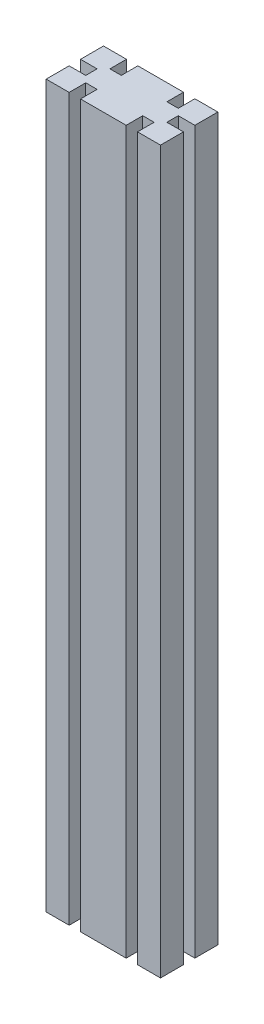
ISO-10303-21;
HEADER;
FILE_DESCRIPTION(('STEP AP214'),'2;1');
FILE_NAME('part.step','',(''),(''),'','','');
FILE_SCHEMA(('AUTOMOTIVE_DESIGN { 1 0 10303 214 1 1 1 1 }'));
ENDSEC;
DATA;
#1=APPLICATION_CONTEXT('core data for automotive mechanical design processes');
#2=APPLICATION_PROTOCOL_DEFINITION('international standard','automotive_design',2000,#1);
#3=PRODUCT_CONTEXT('',#1,'mechanical');
#4=PRODUCT('Part','Part','',(#3));
#5=PRODUCT_RELATED_PRODUCT_CATEGORY('part','',(#4));
#6=PRODUCT_DEFINITION_FORMATION('','',#4);
#7=PRODUCT_DEFINITION_CONTEXT('part definition',#1,'design');
#8=PRODUCT_DEFINITION('design','',#6,#7);
#9=PRODUCT_DEFINITION_SHAPE('','',#8);
#10=(LENGTH_UNIT() NAMED_UNIT(*) SI_UNIT(.MILLI.,.METRE.));
#11=(NAMED_UNIT(*) PLANE_ANGLE_UNIT() SI_UNIT($,.RADIAN.));
#12=(NAMED_UNIT(*) SI_UNIT($,.STERADIAN.) SOLID_ANGLE_UNIT());
#13=UNCERTAINTY_MEASURE_WITH_UNIT(LENGTH_MEASURE(1.E-05),#10,'distance_accuracy_value','');
#14=(GEOMETRIC_REPRESENTATION_CONTEXT(3) GLOBAL_UNCERTAINTY_ASSIGNED_CONTEXT((#13)) GLOBAL_UNIT_ASSIGNED_CONTEXT((#10,
#11,#12)) REPRESENTATION_CONTEXT('',''));
#15=CARTESIAN_POINT('',(0.,0.,0.));
#16=DIRECTION('',(0.,0.,1.));
#17=DIRECTION('',(1.,0.,0.));
#18=AXIS2_PLACEMENT_3D('',#15,#16,#17);
#19=CARTESIAN_POINT('',(28.575,508.,0.));
#20=DIRECTION('',(-1.,0.,0.));
#21=DIRECTION('',(0.,0.,1.));
#22=AXIS2_PLACEMENT_3D('',#19,#20,#21);
#23=PLANE('',#22);
#24=DIRECTION('',(0.,0.,-1.));
#25=VECTOR('',#24,1.);
#26=CARTESIAN_POINT('',(28.575,0.,0.));
#27=LINE('',#26,#25);
#28=CARTESIAN_POINT('',(28.575,0.,4.));
#29=VERTEX_POINT('',#28);
#30=CARTESIAN_POINT('',(28.575,0.,-4.));
#31=VERTEX_POINT('',#30);
#32=EDGE_CURVE('E385',#29,#31,#27,.T.);
#33=ORIENTED_EDGE('',*,*,#32,.T.);
#34=DIRECTION('',(0.,-1.,0.));
#35=VECTOR('',#34,1.);
#36=CARTESIAN_POINT('',(28.575,508.,-4.));
#37=LINE('',#36,#35);
#38=CARTESIAN_POINT('',(28.575,508.,-4.));
#39=VERTEX_POINT('',#38);
#40=EDGE_CURVE('E11',#39,#31,#37,.T.);
#41=ORIENTED_EDGE('',*,*,#40,.F.);
#42=DIRECTION('',(0.,0.,-1.));
#43=VECTOR('',#42,1.);
#44=CARTESIAN_POINT('',(28.575,508.,0.));
#45=LINE('',#44,#43);
#46=CARTESIAN_POINT('',(28.575,508.,4.));
#47=VERTEX_POINT('',#46);
#48=EDGE_CURVE('E282',#47,#39,#45,.T.);
#49=ORIENTED_EDGE('',*,*,#48,.F.);
#50=DIRECTION('',(0.,-1.,0.));
#51=VECTOR('',#50,1.);
#52=CARTESIAN_POINT('',(28.575,508.,4.));
#53=LINE('',#52,#51);
#54=EDGE_CURVE('E64',#47,#29,#53,.T.);
#55=ORIENTED_EDGE('',*,*,#54,.T.);
#56=EDGE_LOOP('',(#33,#41,#49,#55));
#57=FACE_BOUND('',#56,.T.);
#58=ADVANCED_FACE('F47',(#57),#23,.F.);
#59=CARTESIAN_POINT('',(0.,508.,-4.));
#60=DIRECTION('',(0.,0.,-1.));
#61=DIRECTION('',(-1.,0.,0.));
#62=AXIS2_PLACEMENT_3D('',#59,#60,#61);
#63=PLANE('',#62);
#64=DIRECTION('',(1.,0.,0.));
#65=VECTOR('',#64,1.);
#66=CARTESIAN_POINT('',(0.,0.,-4.));
#67=LINE('',#66,#65);
#68=CARTESIAN_POINT('',(40.259,0.,-4.));
#69=VERTEX_POINT('',#68);
#70=EDGE_CURVE('E382',#31,#69,#67,.T.);
#71=ORIENTED_EDGE('',*,*,#70,.T.);
#72=DIRECTION('',(0.,-1.,0.));
#73=VECTOR('',#72,1.);
#74=CARTESIAN_POINT('',(40.259,508.,-4.));
#75=LINE('',#74,#73);
#76=CARTESIAN_POINT('',(40.259,508.,-4.));
#77=VERTEX_POINT('',#76);
#78=EDGE_CURVE('E56',#77,#69,#75,.T.);
#79=ORIENTED_EDGE('',*,*,#78,.F.);
#80=DIRECTION('',(1.,0.,0.));
#81=VECTOR('',#80,1.);
#82=CARTESIAN_POINT('',(0.,508.,-4.));
#83=LINE('',#82,#81);
#84=EDGE_CURVE('E162',#39,#77,#83,.T.);
#85=ORIENTED_EDGE('',*,*,#84,.F.);
#86=ORIENTED_EDGE('',*,*,#40,.T.);
#87=EDGE_LOOP('',(#71,#79,#85,#86));
#88=FACE_BOUND('',#87,.T.);
#89=ADVANCED_FACE('F383',(#88),#63,.F.);
#90=CARTESIAN_POINT('',(40.259,508.,0.));
#91=DIRECTION('',(1.,0.,0.));
#92=DIRECTION('',(0.,0.,-1.));
#93=AXIS2_PLACEMENT_3D('',#90,#91,#92);
#94=PLANE('',#93);
#95=DIRECTION('',(0.,0.,1.));
#96=VECTOR('',#95,1.);
#97=CARTESIAN_POINT('',(40.259,0.,0.));
#98=LINE('',#97,#96);
#99=CARTESIAN_POINT('',(40.259,0.,-20.193));
#100=VERTEX_POINT('',#99);
#101=EDGE_CURVE('E294',#100,#69,#98,.T.);
#102=ORIENTED_EDGE('',*,*,#101,.F.);
#103=DIRECTION('',(0.,-1.,0.));
#104=VECTOR('',#103,1.);
#105=CARTESIAN_POINT('',(40.259,508.,-20.193));
#106=LINE('',#105,#104);
#107=CARTESIAN_POINT('',(40.259,508.,-20.193));
#108=VERTEX_POINT('',#107);
#109=EDGE_CURVE('E374',#108,#100,#106,.T.);
#110=ORIENTED_EDGE('',*,*,#109,.F.);
#111=DIRECTION('',(0.,0.,1.));
#112=VECTOR('',#111,1.);
#113=CARTESIAN_POINT('',(40.259,508.,0.));
#114=LINE('',#113,#112);
#115=EDGE_CURVE('E266',#108,#77,#114,.T.);
#116=ORIENTED_EDGE('',*,*,#115,.T.);
#117=ORIENTED_EDGE('',*,*,#78,.T.);
#118=EDGE_LOOP('',(#102,#110,#116,#117));
#119=FACE_BOUND('',#118,.T.);
#120=ADVANCED_FACE('F379',(#119),#94,.T.);
#121=CARTESIAN_POINT('',(0.,508.,-20.193));
#122=DIRECTION('',(0.,0.,-1.));
#123=DIRECTION('',(-1.,0.,0.));
#124=AXIS2_PLACEMENT_3D('',#121,#122,#123);
#125=PLANE('',#124);
#126=DIRECTION('',(1.,0.,0.));
#127=VECTOR('',#126,1.);
#128=CARTESIAN_POINT('',(0.,0.,-20.193));
#129=LINE('',#128,#127);
#130=CARTESIAN_POINT('',(24.075,0.,-20.193));
#131=VERTEX_POINT('',#130);
#132=EDGE_CURVE('E390',#131,#100,#129,.T.);
#133=ORIENTED_EDGE('',*,*,#132,.F.);
#134=DIRECTION('',(0.,-1.,0.));
#135=VECTOR('',#134,1.);
#136=CARTESIAN_POINT('',(24.075,508.,-20.193));
#137=LINE('',#136,#135);
#138=CARTESIAN_POINT('',(24.075,508.,-20.193));
#139=VERTEX_POINT('',#138);
#140=EDGE_CURVE('E371',#139,#131,#137,.T.);
#141=ORIENTED_EDGE('',*,*,#140,.F.);
#142=DIRECTION('',(1.,0.,0.));
#143=VECTOR('',#142,1.);
#144=CARTESIAN_POINT('',(0.,508.,-20.193));
#145=LINE('',#144,#143);
#146=EDGE_CURVE('E273',#139,#108,#145,.T.);
#147=ORIENTED_EDGE('',*,*,#146,.T.);
#148=ORIENTED_EDGE('',*,*,#109,.T.);
#149=EDGE_LOOP('',(#133,#141,#147,#148));
#150=FACE_BOUND('',#149,.T.);
#151=ADVANCED_FACE('F508',(#150),#125,.T.);
#152=CARTESIAN_POINT('',(24.075,508.,0.));
#153=DIRECTION('',(1.,0.,0.));
#154=DIRECTION('',(0.,0.,-1.));
#155=AXIS2_PLACEMENT_3D('',#152,#153,#154);
#156=PLANE('',#155);
#157=DIRECTION('',(0.,0.,1.));
#158=VECTOR('',#157,1.);
#159=CARTESIAN_POINT('',(24.075,0.,0.));
#160=LINE('',#159,#158);
#161=CARTESIAN_POINT('',(24.075,0.,-8.509));
#162=VERTEX_POINT('',#161);
#163=EDGE_CURVE('E393',#131,#162,#160,.T.);
#164=ORIENTED_EDGE('',*,*,#163,.T.);
#165=DIRECTION('',(0.,-1.,0.));
#166=VECTOR('',#165,1.);
#167=CARTESIAN_POINT('',(24.075,508.,-8.509));
#168=LINE('',#167,#166);
#169=CARTESIAN_POINT('',(24.075,508.,-8.509));
#170=VERTEX_POINT('',#169);
#171=EDGE_CURVE('E368',#170,#162,#168,.T.);
#172=ORIENTED_EDGE('',*,*,#171,.F.);
#173=DIRECTION('',(0.,0.,1.));
#174=VECTOR('',#173,1.);
#175=CARTESIAN_POINT('',(24.075,508.,0.));
#176=LINE('',#175,#174);
#177=EDGE_CURVE('E279',#139,#170,#176,.T.);
#178=ORIENTED_EDGE('',*,*,#177,.F.);
#179=ORIENTED_EDGE('',*,*,#140,.T.);
#180=EDGE_LOOP('',(#164,#172,#178,#179));
#181=FACE_BOUND('',#180,.T.);
#182=ADVANCED_FACE('F510',(#181),#156,.F.);
#183=CARTESIAN_POINT('',(0.,508.,-8.509));
#184=DIRECTION('',(0.,0.,-1.));
#185=DIRECTION('',(-1.,0.,0.));
#186=AXIS2_PLACEMENT_3D('',#183,#184,#185);
#187=PLANE('',#186);
#188=DIRECTION('',(1.,0.,0.));
#189=VECTOR('',#188,1.);
#190=CARTESIAN_POINT('',(0.,0.,-8.509));
#191=LINE('',#190,#189);
#192=CARTESIAN_POINT('',(16.075,0.,-8.509));
#193=VERTEX_POINT('',#192);
#194=EDGE_CURVE('E402',#193,#162,#191,.T.);
#195=ORIENTED_EDGE('',*,*,#194,.F.);
#196=DIRECTION('',(0.,-1.,0.));
#197=VECTOR('',#196,1.);
#198=CARTESIAN_POINT('',(16.075,508.,-8.509));
#199=LINE('',#198,#197);
#200=CARTESIAN_POINT('',(16.075,508.,-8.509));
#201=VERTEX_POINT('',#200);
#202=EDGE_CURVE('E365',#201,#193,#199,.T.);
#203=ORIENTED_EDGE('',*,*,#202,.F.);
#204=DIRECTION('',(1.,0.,0.));
#205=VECTOR('',#204,1.);
#206=CARTESIAN_POINT('',(0.,508.,-8.509));
#207=LINE('',#206,#205);
#208=EDGE_CURVE('E769',#201,#170,#207,.T.);
#209=ORIENTED_EDGE('',*,*,#208,.T.);
#210=ORIENTED_EDGE('',*,*,#171,.T.);
#211=EDGE_LOOP('',(#195,#203,#209,#210));
#212=FACE_BOUND('',#211,.T.);
#213=ADVANCED_FACE('F513',(#212),#187,.T.);
#214=CARTESIAN_POINT('',(16.075,508.,0.));
#215=DIRECTION('',(1.,0.,0.));
#216=DIRECTION('',(0.,0.,-1.));
#217=AXIS2_PLACEMENT_3D('',#214,#215,#216);
#218=PLANE('',#217);
#219=DIRECTION('',(0.,0.,1.));
#220=VECTOR('',#219,1.);
#221=CARTESIAN_POINT('',(16.075,0.,0.));
#222=LINE('',#221,#220);
#223=CARTESIAN_POINT('',(16.075,0.,-20.193));
#224=VERTEX_POINT('',#223);
#225=EDGE_CURVE('E406',#224,#193,#222,.T.);
#226=ORIENTED_EDGE('',*,*,#225,.F.);
#227=DIRECTION('',(0.,-1.,0.));
#228=VECTOR('',#227,1.);
#229=CARTESIAN_POINT('',(16.075,508.,-20.193));
#230=LINE('',#229,#228);
#231=CARTESIAN_POINT('',(16.075,508.,-20.193));
#232=VERTEX_POINT('',#231);
#233=EDGE_CURVE('E362',#232,#224,#230,.T.);
#234=ORIENTED_EDGE('',*,*,#233,.F.);
#235=DIRECTION('',(0.,0.,1.));
#236=VECTOR('',#235,1.);
#237=CARTESIAN_POINT('',(16.075,508.,0.));
#238=LINE('',#237,#236);
#239=EDGE_CURVE('E775',#232,#201,#238,.T.);
#240=ORIENTED_EDGE('',*,*,#239,.T.);
#241=ORIENTED_EDGE('',*,*,#202,.T.);
#242=EDGE_LOOP('',(#226,#234,#240,#241));
#243=FACE_BOUND('',#242,.T.);
#244=ADVANCED_FACE('F517',(#243),#218,.T.);
#245=CARTESIAN_POINT('',(-16.075,0.,-20.193));
#246=VERTEX_POINT('',#245);
#247=EDGE_CURVE('E396',#246,#224,#129,.T.);
#248=ORIENTED_EDGE('',*,*,#247,.F.);
#249=DIRECTION('',(0.,-1.,0.));
#250=VECTOR('',#249,1.);
#251=CARTESIAN_POINT('',(-16.075,508.,-20.193));
#252=LINE('',#251,#250);
#253=CARTESIAN_POINT('',(-16.075,508.,-20.193));
#254=VERTEX_POINT('',#253);
#255=EDGE_CURVE('E359',#254,#246,#252,.T.);
#256=ORIENTED_EDGE('',*,*,#255,.F.);
#257=EDGE_CURVE('E281',#254,#232,#145,.T.);
#258=ORIENTED_EDGE('',*,*,#257,.T.);
#259=ORIENTED_EDGE('',*,*,#233,.T.);
#260=EDGE_LOOP('',(#248,#256,#258,#259));
#261=FACE_BOUND('',#260,.T.);
#262=ADVANCED_FACE('F521',(#261),#125,.T.);
#263=CARTESIAN_POINT('',(-16.075,508.,0.));
#264=DIRECTION('',(1.,0.,0.));
#265=DIRECTION('',(0.,0.,-1.));
#266=AXIS2_PLACEMENT_3D('',#263,#264,#265);
#267=PLANE('',#266);
#268=DIRECTION('',(0.,0.,1.));
#269=VECTOR('',#268,1.);
#270=CARTESIAN_POINT('',(-16.075,0.,0.));
#271=LINE('',#270,#269);
#272=CARTESIAN_POINT('',(-16.075,0.,-8.509));
#273=VERTEX_POINT('',#272);
#274=EDGE_CURVE('E410',#246,#273,#271,.T.);
#275=ORIENTED_EDGE('',*,*,#274,.T.);
#276=DIRECTION('',(0.,-1.,0.));
#277=VECTOR('',#276,1.);
#278=CARTESIAN_POINT('',(-16.075,508.,-8.509));
#279=LINE('',#278,#277);
#280=CARTESIAN_POINT('',(-16.075,508.,-8.509));
#281=VERTEX_POINT('',#280);
#282=EDGE_CURVE('E355',#281,#273,#279,.T.);
#283=ORIENTED_EDGE('',*,*,#282,.F.);
#284=DIRECTION('',(0.,0.,1.));
#285=VECTOR('',#284,1.);
#286=CARTESIAN_POINT('',(-16.075,508.,0.));
#287=LINE('',#286,#285);
#288=EDGE_CURVE('E780',#254,#281,#287,.T.);
#289=ORIENTED_EDGE('',*,*,#288,.F.);
#290=ORIENTED_EDGE('',*,*,#255,.T.);
#291=EDGE_LOOP('',(#275,#283,#289,#290));
#292=FACE_BOUND('',#291,.T.);
#293=ADVANCED_FACE('F523',(#292),#267,.F.);
#294=CARTESIAN_POINT('',(0.,508.,-8.509));
#295=DIRECTION('',(0.,0.,1.));
#296=DIRECTION('',(1.,0.,0.));
#297=AXIS2_PLACEMENT_3D('',#294,#295,#296);
#298=PLANE('',#297);
#299=DIRECTION('',(-1.,0.,0.));
#300=VECTOR('',#299,1.);
#301=CARTESIAN_POINT('',(0.,0.,-8.509));
#302=LINE('',#301,#300);
#303=CARTESIAN_POINT('',(-24.075,0.,-8.509));
#304=VERTEX_POINT('',#303);
#305=EDGE_CURVE('E413',#273,#304,#302,.T.);
#306=ORIENTED_EDGE('',*,*,#305,.T.);
#307=DIRECTION('',(0.,-1.,0.));
#308=VECTOR('',#307,1.);
#309=CARTESIAN_POINT('',(-24.075,508.,-8.509));
#310=LINE('',#309,#308);
#311=CARTESIAN_POINT('',(-24.075,508.,-8.509));
#312=VERTEX_POINT('',#311);
#313=EDGE_CURVE('E352',#312,#304,#310,.T.);
#314=ORIENTED_EDGE('',*,*,#313,.F.);
#315=DIRECTION('',(-1.,0.,0.));
#316=VECTOR('',#315,1.);
#317=CARTESIAN_POINT('',(0.,508.,-8.509));
#318=LINE('',#317,#316);
#319=EDGE_CURVE('E783',#281,#312,#318,.T.);
#320=ORIENTED_EDGE('',*,*,#319,.F.);
#321=ORIENTED_EDGE('',*,*,#282,.T.);
#322=EDGE_LOOP('',(#306,#314,#320,#321));
#323=FACE_BOUND('',#322,.T.);
#324=ADVANCED_FACE('F526',(#323),#298,.F.);
#325=CARTESIAN_POINT('',(-24.075,508.,0.));
#326=DIRECTION('',(1.,0.,0.));
#327=DIRECTION('',(0.,0.,-1.));
#328=AXIS2_PLACEMENT_3D('',#325,#326,#327);
#329=PLANE('',#328);
#330=DIRECTION('',(0.,0.,1.));
#331=VECTOR('',#330,1.);
#332=CARTESIAN_POINT('',(-24.075,0.,0.));
#333=LINE('',#332,#331);
#334=CARTESIAN_POINT('',(-24.075,0.,-20.193));
#335=VERTEX_POINT('',#334);
#336=EDGE_CURVE('E417',#335,#304,#333,.T.);
#337=ORIENTED_EDGE('',*,*,#336,.F.);
#338=DIRECTION('',(0.,-1.,0.));
#339=VECTOR('',#338,1.);
#340=CARTESIAN_POINT('',(-24.075,508.,-20.193));
#341=LINE('',#340,#339);
#342=CARTESIAN_POINT('',(-24.075,508.,-20.193));
#343=VERTEX_POINT('',#342);
#344=EDGE_CURVE('E349',#343,#335,#341,.T.);
#345=ORIENTED_EDGE('',*,*,#344,.F.);
#346=DIRECTION('',(0.,0.,1.));
#347=VECTOR('',#346,1.);
#348=CARTESIAN_POINT('',(-24.075,508.,0.));
#349=LINE('',#348,#347);
#350=EDGE_CURVE('E786',#343,#312,#349,.T.);
#351=ORIENTED_EDGE('',*,*,#350,.T.);
#352=ORIENTED_EDGE('',*,*,#313,.T.);
#353=EDGE_LOOP('',(#337,#345,#351,#352));
#354=FACE_BOUND('',#353,.T.);
#355=ADVANCED_FACE('F530',(#354),#329,.T.);
#356=CARTESIAN_POINT('',(-40.259,0.,-20.193));
#357=VERTEX_POINT('',#356);
#358=EDGE_CURVE('E395',#357,#335,#129,.T.);
#359=ORIENTED_EDGE('',*,*,#358,.F.);
#360=DIRECTION('',(0.,-1.,0.));
#361=VECTOR('',#360,1.);
#362=CARTESIAN_POINT('',(-40.259,508.,-20.193));
#363=LINE('',#362,#361);
#364=CARTESIAN_POINT('',(-40.259,508.,-20.193));
#365=VERTEX_POINT('',#364);
#366=EDGE_CURVE('E346',#365,#357,#363,.T.);
#367=ORIENTED_EDGE('',*,*,#366,.F.);
#368=EDGE_CURVE('E280',#365,#343,#145,.T.);
#369=ORIENTED_EDGE('',*,*,#368,.T.);
#370=ORIENTED_EDGE('',*,*,#344,.T.);
#371=EDGE_LOOP('',(#359,#367,#369,#370));
#372=FACE_BOUND('',#371,.T.);
#373=ADVANCED_FACE('F534',(#372),#125,.T.);
#374=CARTESIAN_POINT('',(-40.259,508.,0.));
#375=DIRECTION('',(1.,0.,0.));
#376=DIRECTION('',(0.,0.,-1.));
#377=AXIS2_PLACEMENT_3D('',#374,#375,#376);
#378=PLANE('',#377);
#379=DIRECTION('',(0.,0.,1.));
#380=VECTOR('',#379,1.);
#381=CARTESIAN_POINT('',(-40.259,0.,0.));
#382=LINE('',#381,#380);
#383=CARTESIAN_POINT('',(-40.259,0.,-4.));
#384=VERTEX_POINT('',#383);
#385=EDGE_CURVE('E421',#357,#384,#382,.T.);
#386=ORIENTED_EDGE('',*,*,#385,.T.);
#387=DIRECTION('',(0.,-1.,0.));
#388=VECTOR('',#387,1.);
#389=CARTESIAN_POINT('',(-40.259,508.,-4.));
#390=LINE('',#389,#388);
#391=CARTESIAN_POINT('',(-40.259,508.,-4.));
#392=VERTEX_POINT('',#391);
#393=EDGE_CURVE('E343',#392,#384,#390,.T.);
#394=ORIENTED_EDGE('',*,*,#393,.F.);
#395=DIRECTION('',(0.,0.,1.));
#396=VECTOR('',#395,1.);
#397=CARTESIAN_POINT('',(-40.259,508.,0.));
#398=LINE('',#397,#396);
#399=EDGE_CURVE('E790',#365,#392,#398,.T.);
#400=ORIENTED_EDGE('',*,*,#399,.F.);
#401=ORIENTED_EDGE('',*,*,#366,.T.);
#402=EDGE_LOOP('',(#386,#394,#400,#401));
#403=FACE_BOUND('',#402,.T.);
#404=ADVANCED_FACE('F538',(#403),#378,.F.);
#405=CARTESIAN_POINT('',(0.,508.,-4.));
#406=DIRECTION('',(0.,0.,1.));
#407=DIRECTION('',(1.,0.,0.));
#408=AXIS2_PLACEMENT_3D('',#405,#406,#407);
#409=PLANE('',#408);
#410=DIRECTION('',(-1.,0.,0.));
#411=VECTOR('',#410,1.);
#412=CARTESIAN_POINT('',(0.,0.,-4.));
#413=LINE('',#412,#411);
#414=CARTESIAN_POINT('',(-28.575,0.,-4.));
#415=VERTEX_POINT('',#414);
#416=EDGE_CURVE('E425',#415,#384,#413,.T.);
#417=ORIENTED_EDGE('',*,*,#416,.F.);
#418=DIRECTION('',(0.,-1.,0.));
#419=VECTOR('',#418,1.);
#420=CARTESIAN_POINT('',(-28.575,508.,-4.));
#421=LINE('',#420,#419);
#422=CARTESIAN_POINT('',(-28.575,508.,-4.));
#423=VERTEX_POINT('',#422);
#424=EDGE_CURVE('E340',#423,#415,#421,.T.);
#425=ORIENTED_EDGE('',*,*,#424,.F.);
#426=DIRECTION('',(-1.,0.,0.));
#427=VECTOR('',#426,1.);
#428=CARTESIAN_POINT('',(0.,508.,-4.));
#429=LINE('',#428,#427);
#430=EDGE_CURVE('E793',#423,#392,#429,.T.);
#431=ORIENTED_EDGE('',*,*,#430,.T.);
#432=ORIENTED_EDGE('',*,*,#393,.T.);
#433=EDGE_LOOP('',(#417,#425,#431,#432));
#434=FACE_BOUND('',#433,.T.);
#435=ADVANCED_FACE('F540',(#434),#409,.T.);
#436=CARTESIAN_POINT('',(-28.575,508.,0.));
#437=DIRECTION('',(-1.,0.,0.));
#438=DIRECTION('',(0.,0.,1.));
#439=AXIS2_PLACEMENT_3D('',#436,#437,#438);
#440=PLANE('',#439);
#441=DIRECTION('',(0.,0.,-1.));
#442=VECTOR('',#441,1.);
#443=CARTESIAN_POINT('',(-28.575,0.,0.));
#444=LINE('',#443,#442);
#445=CARTESIAN_POINT('',(-28.575,0.,4.));
#446=VERTEX_POINT('',#445);
#447=EDGE_CURVE('E430',#446,#415,#444,.T.);
#448=ORIENTED_EDGE('',*,*,#447,.F.);
#449=DIRECTION('',(0.,-1.,0.));
#450=VECTOR('',#449,1.);
#451=CARTESIAN_POINT('',(-28.575,508.,4.));
#452=LINE('',#451,#450);
#453=CARTESIAN_POINT('',(-28.575,508.,4.));
#454=VERTEX_POINT('',#453);
#455=EDGE_CURVE('E337',#454,#446,#452,.T.);
#456=ORIENTED_EDGE('',*,*,#455,.F.);
#457=DIRECTION('',(0.,0.,-1.));
#458=VECTOR('',#457,1.);
#459=CARTESIAN_POINT('',(-28.575,508.,0.));
#460=LINE('',#459,#458);
#461=EDGE_CURVE('E798',#454,#423,#460,.T.);
#462=ORIENTED_EDGE('',*,*,#461,.T.);
#463=ORIENTED_EDGE('',*,*,#424,.T.);
#464=EDGE_LOOP('',(#448,#456,#462,#463));
#465=FACE_BOUND('',#464,.T.);
#466=ADVANCED_FACE('F543',(#465),#440,.T.);
#467=CARTESIAN_POINT('',(0.,508.,4.));
#468=DIRECTION('',(0.,0.,1.));
#469=DIRECTION('',(1.,0.,0.));
#470=AXIS2_PLACEMENT_3D('',#467,#468,#469);
#471=PLANE('',#470);
#472=DIRECTION('',(-1.,0.,0.));
#473=VECTOR('',#472,1.);
#474=CARTESIAN_POINT('',(0.,0.,4.));
#475=LINE('',#474,#473);
#476=CARTESIAN_POINT('',(-40.259,0.,4.));
#477=VERTEX_POINT('',#476);
#478=EDGE_CURVE('E434',#446,#477,#475,.T.);
#479=ORIENTED_EDGE('',*,*,#478,.T.);
#480=DIRECTION('',(0.,-1.,0.));
#481=VECTOR('',#480,1.);
#482=CARTESIAN_POINT('',(-40.259,508.,4.));
#483=LINE('',#482,#481);
#484=CARTESIAN_POINT('',(-40.259,508.,4.));
#485=VERTEX_POINT('',#484);
#486=EDGE_CURVE('E333',#485,#477,#483,.T.);
#487=ORIENTED_EDGE('',*,*,#486,.F.);
#488=DIRECTION('',(-1.,0.,0.));
#489=VECTOR('',#488,1.);
#490=CARTESIAN_POINT('',(0.,508.,4.));
#491=LINE('',#490,#489);
#492=EDGE_CURVE('E802',#454,#485,#491,.T.);
#493=ORIENTED_EDGE('',*,*,#492,.F.);
#494=ORIENTED_EDGE('',*,*,#455,.T.);
#495=EDGE_LOOP('',(#479,#487,#493,#494));
#496=FACE_BOUND('',#495,.T.);
#497=ADVANCED_FACE('F547',(#496),#471,.F.);
#498=CARTESIAN_POINT('',(-40.259,0.,20.193));
#499=VERTEX_POINT('',#498);
#500=EDGE_CURVE('E426',#477,#499,#382,.T.);
#501=ORIENTED_EDGE('',*,*,#500,.T.);
#502=DIRECTION('',(0.,-1.,0.));
#503=VECTOR('',#502,1.);
#504=CARTESIAN_POINT('',(-40.259,508.,20.193));
#505=LINE('',#504,#503);
#506=CARTESIAN_POINT('',(-40.259,508.,20.193));
#507=VERTEX_POINT('',#506);
#508=EDGE_CURVE('E329',#507,#499,#505,.T.);
#509=ORIENTED_EDGE('',*,*,#508,.F.);
#510=EDGE_CURVE('E794',#485,#507,#398,.T.);
#511=ORIENTED_EDGE('',*,*,#510,.F.);
#512=ORIENTED_EDGE('',*,*,#486,.T.);
#513=EDGE_LOOP('',(#501,#509,#511,#512));
#514=FACE_BOUND('',#513,.T.);
#515=ADVANCED_FACE('F551',(#514),#378,.F.);
#516=CARTESIAN_POINT('',(0.,508.,20.193));
#517=DIRECTION('',(0.,0.,-1.));
#518=DIRECTION('',(-1.,0.,0.));
#519=AXIS2_PLACEMENT_3D('',#516,#517,#518);
#520=PLANE('',#519);
#521=DIRECTION('',(1.,0.,0.));
#522=VECTOR('',#521,1.);
#523=CARTESIAN_POINT('',(0.,0.,20.193));
#524=LINE('',#523,#522);
#525=CARTESIAN_POINT('',(-24.075,0.,20.193));
#526=VERTEX_POINT('',#525);
#527=EDGE_CURVE('E437',#499,#526,#524,.T.);
#528=ORIENTED_EDGE('',*,*,#527,.T.);
#529=DIRECTION('',(0.,-1.,0.));
#530=VECTOR('',#529,1.);
#531=CARTESIAN_POINT('',(-24.075,508.,20.193));
#532=LINE('',#531,#530);
#533=CARTESIAN_POINT('',(-24.075,508.,20.193));
#534=VERTEX_POINT('',#533);
#535=EDGE_CURVE('E325',#534,#526,#532,.T.);
#536=ORIENTED_EDGE('',*,*,#535,.F.);
#537=DIRECTION('',(1.,0.,0.));
#538=VECTOR('',#537,1.);
#539=CARTESIAN_POINT('',(0.,508.,20.193));
#540=LINE('',#539,#538);
#541=EDGE_CURVE('E251',#507,#534,#540,.T.);
#542=ORIENTED_EDGE('',*,*,#541,.F.);
#543=ORIENTED_EDGE('',*,*,#508,.T.);
#544=EDGE_LOOP('',(#528,#536,#542,#543));
#545=FACE_BOUND('',#544,.T.);
#546=ADVANCED_FACE('F555',(#545),#520,.F.);
#547=CARTESIAN_POINT('',(-24.075,508.,0.));
#548=DIRECTION('',(-1.,0.,0.));
#549=DIRECTION('',(0.,0.,1.));
#550=AXIS2_PLACEMENT_3D('',#547,#548,#549);
#551=PLANE('',#550);
#552=DIRECTION('',(0.,0.,-1.));
#553=VECTOR('',#552,1.);
#554=CARTESIAN_POINT('',(-24.075,0.,0.));
#555=LINE('',#554,#553);
#556=CARTESIAN_POINT('',(-24.075,0.,8.509));
#557=VERTEX_POINT('',#556);
#558=EDGE_CURVE('E440',#526,#557,#555,.T.);
#559=ORIENTED_EDGE('',*,*,#558,.T.);
#560=DIRECTION('',(0.,-1.,0.));
#561=VECTOR('',#560,1.);
#562=CARTESIAN_POINT('',(-24.075,508.,8.509));
#563=LINE('',#562,#561);
#564=CARTESIAN_POINT('',(-24.075,508.,8.509));
#565=VERTEX_POINT('',#564);
#566=EDGE_CURVE('E322',#565,#557,#563,.T.);
#567=ORIENTED_EDGE('',*,*,#566,.F.);
#568=DIRECTION('',(0.,0.,-1.));
#569=VECTOR('',#568,1.);
#570=CARTESIAN_POINT('',(-24.075,508.,0.));
#571=LINE('',#570,#569);
#572=EDGE_CURVE('E806',#534,#565,#571,.T.);
#573=ORIENTED_EDGE('',*,*,#572,.F.);
#574=ORIENTED_EDGE('',*,*,#535,.T.);
#575=EDGE_LOOP('',(#559,#567,#573,#574));
#576=FACE_BOUND('',#575,.T.);
#577=ADVANCED_FACE('F557',(#576),#551,.F.);
#578=CARTESIAN_POINT('',(0.,508.,8.509));
#579=DIRECTION('',(0.,0.,1.));
#580=DIRECTION('',(1.,0.,0.));
#581=AXIS2_PLACEMENT_3D('',#578,#579,#580);
#582=PLANE('',#581);
#583=DIRECTION('',(-1.,0.,0.));
#584=VECTOR('',#583,1.);
#585=CARTESIAN_POINT('',(0.,0.,8.509));
#586=LINE('',#585,#584);
#587=CARTESIAN_POINT('',(-16.075,0.,8.509));
#588=VERTEX_POINT('',#587);
#589=EDGE_CURVE('E445',#588,#557,#586,.T.);
#590=ORIENTED_EDGE('',*,*,#589,.F.);
#591=DIRECTION('',(0.,-1.,0.));
#592=VECTOR('',#591,1.);
#593=CARTESIAN_POINT('',(-16.075,508.,8.509));
#594=LINE('',#593,#592);
#595=CARTESIAN_POINT('',(-16.075,508.,8.509));
#596=VERTEX_POINT('',#595);
#597=EDGE_CURVE('E319',#596,#588,#594,.T.);
#598=ORIENTED_EDGE('',*,*,#597,.F.);
#599=DIRECTION('',(-1.,0.,0.));
#600=VECTOR('',#599,1.);
#601=CARTESIAN_POINT('',(0.,508.,8.509));
#602=LINE('',#601,#600);
#603=EDGE_CURVE('E808',#596,#565,#602,.T.);
#604=ORIENTED_EDGE('',*,*,#603,.T.);
#605=ORIENTED_EDGE('',*,*,#566,.T.);
#606=EDGE_LOOP('',(#590,#598,#604,#605));
#607=FACE_BOUND('',#606,.T.);
#608=ADVANCED_FACE('F560',(#607),#582,.T.);
#609=CARTESIAN_POINT('',(-16.075,508.,0.));
#610=DIRECTION('',(-1.,0.,0.));
#611=DIRECTION('',(0.,0.,1.));
#612=AXIS2_PLACEMENT_3D('',#609,#610,#611);
#613=PLANE('',#612);
#614=DIRECTION('',(0.,0.,-1.));
#615=VECTOR('',#614,1.);
#616=CARTESIAN_POINT('',(-16.075,0.,0.));
#617=LINE('',#616,#615);
#618=CARTESIAN_POINT('',(-16.075,0.,20.193));
#619=VERTEX_POINT('',#618);
#620=EDGE_CURVE('E449',#619,#588,#617,.T.);
#621=ORIENTED_EDGE('',*,*,#620,.F.);
#622=DIRECTION('',(0.,-1.,0.));
#623=VECTOR('',#622,1.);
#624=CARTESIAN_POINT('',(-16.075,508.,20.193));
#625=LINE('',#624,#623);
#626=CARTESIAN_POINT('',(-16.075,508.,20.193));
#627=VERTEX_POINT('',#626);
#628=EDGE_CURVE('E316',#627,#619,#625,.T.);
#629=ORIENTED_EDGE('',*,*,#628,.F.);
#630=DIRECTION('',(0.,0.,-1.));
#631=VECTOR('',#630,1.);
#632=CARTESIAN_POINT('',(-16.075,508.,0.));
#633=LINE('',#632,#631);
#634=EDGE_CURVE('E485',#627,#596,#633,.T.);
#635=ORIENTED_EDGE('',*,*,#634,.T.);
#636=ORIENTED_EDGE('',*,*,#597,.T.);
#637=EDGE_LOOP('',(#621,#629,#635,#636));
#638=FACE_BOUND('',#637,.T.);
#639=ADVANCED_FACE('F564',(#638),#613,.T.);
#640=CARTESIAN_POINT('',(16.075,0.,20.193));
#641=VERTEX_POINT('',#640);
#642=EDGE_CURVE('E441',#619,#641,#524,.T.);
#643=ORIENTED_EDGE('',*,*,#642,.T.);
#644=DIRECTION('',(0.,-1.,0.));
#645=VECTOR('',#644,1.);
#646=CARTESIAN_POINT('',(16.075,508.,20.193));
#647=LINE('',#646,#645);
#648=CARTESIAN_POINT('',(16.075,508.,20.193));
#649=VERTEX_POINT('',#648);
#650=EDGE_CURVE('E312',#649,#641,#647,.T.);
#651=ORIENTED_EDGE('',*,*,#650,.F.);
#652=EDGE_CURVE('E250',#627,#649,#540,.T.);
#653=ORIENTED_EDGE('',*,*,#652,.F.);
#654=ORIENTED_EDGE('',*,*,#628,.T.);
#655=EDGE_LOOP('',(#643,#651,#653,#654));
#656=FACE_BOUND('',#655,.T.);
#657=ADVANCED_FACE('F469',(#656),#520,.F.);
#658=CARTESIAN_POINT('',(16.075,508.,0.));
#659=DIRECTION('',(-1.,0.,0.));
#660=DIRECTION('',(0.,0.,1.));
#661=AXIS2_PLACEMENT_3D('',#658,#659,#660);
#662=PLANE('',#661);
#663=DIRECTION('',(0.,0.,-1.));
#664=VECTOR('',#663,1.);
#665=CARTESIAN_POINT('',(16.075,0.,0.));
#666=LINE('',#665,#664);
#667=CARTESIAN_POINT('',(16.075,0.,8.509));
#668=VERTEX_POINT('',#667);
#669=EDGE_CURVE('E453',#641,#668,#666,.T.);
#670=ORIENTED_EDGE('',*,*,#669,.T.);
#671=DIRECTION('',(0.,-1.,0.));
#672=VECTOR('',#671,1.);
#673=CARTESIAN_POINT('',(16.075,508.,8.509));
#674=LINE('',#673,#672);
#675=CARTESIAN_POINT('',(16.075,508.,8.509));
#676=VERTEX_POINT('',#675);
#677=EDGE_CURVE('E308',#676,#668,#674,.T.);
#678=ORIENTED_EDGE('',*,*,#677,.F.);
#679=DIRECTION('',(0.,0.,-1.));
#680=VECTOR('',#679,1.);
#681=CARTESIAN_POINT('',(16.075,508.,0.));
#682=LINE('',#681,#680);
#683=EDGE_CURVE('E477',#649,#676,#682,.T.);
#684=ORIENTED_EDGE('',*,*,#683,.F.);
#685=ORIENTED_EDGE('',*,*,#650,.T.);
#686=EDGE_LOOP('',(#670,#678,#684,#685));
#687=FACE_BOUND('',#686,.T.);
#688=ADVANCED_FACE('F475',(#687),#662,.F.);
#689=CARTESIAN_POINT('',(0.,508.,8.509));
#690=DIRECTION('',(0.,0.,-1.));
#691=DIRECTION('',(-1.,0.,0.));
#692=AXIS2_PLACEMENT_3D('',#689,#690,#691);
#693=PLANE('',#692);
#694=DIRECTION('',(1.,0.,0.));
#695=VECTOR('',#694,1.);
#696=CARTESIAN_POINT('',(0.,0.,8.509));
#697=LINE('',#696,#695);
#698=CARTESIAN_POINT('',(24.075,0.,8.509));
#699=VERTEX_POINT('',#698);
#700=EDGE_CURVE('E455',#668,#699,#697,.T.);
#701=ORIENTED_EDGE('',*,*,#700,.T.);
#702=DIRECTION('',(0.,-1.,0.));
#703=VECTOR('',#702,1.);
#704=CARTESIAN_POINT('',(24.075,508.,8.509));
#705=LINE('',#704,#703);
#706=CARTESIAN_POINT('',(24.075,508.,8.509));
#707=VERTEX_POINT('',#706);
#708=EDGE_CURVE('E305',#707,#699,#705,.T.);
#709=ORIENTED_EDGE('',*,*,#708,.F.);
#710=DIRECTION('',(1.,0.,0.));
#711=VECTOR('',#710,1.);
#712=CARTESIAN_POINT('',(0.,508.,8.509));
#713=LINE('',#712,#711);
#714=EDGE_CURVE('E480',#676,#707,#713,.T.);
#715=ORIENTED_EDGE('',*,*,#714,.F.);
#716=ORIENTED_EDGE('',*,*,#677,.T.);
#717=EDGE_LOOP('',(#701,#709,#715,#716));
#718=FACE_BOUND('',#717,.T.);
#719=ADVANCED_FACE('F571',(#718),#693,.F.);
#720=CARTESIAN_POINT('',(24.075,508.,0.));
#721=DIRECTION('',(-1.,0.,0.));
#722=DIRECTION('',(0.,0.,1.));
#723=AXIS2_PLACEMENT_3D('',#720,#721,#722);
#724=PLANE('',#723);
#725=DIRECTION('',(0.,0.,-1.));
#726=VECTOR('',#725,1.);
#727=CARTESIAN_POINT('',(24.075,0.,0.));
#728=LINE('',#727,#726);
#729=CARTESIAN_POINT('',(24.075,0.,20.193));
#730=VERTEX_POINT('',#729);
#731=EDGE_CURVE('E297',#730,#699,#728,.T.);
#732=ORIENTED_EDGE('',*,*,#731,.F.);
#733=DIRECTION('',(0.,-1.,0.));
#734=VECTOR('',#733,1.);
#735=CARTESIAN_POINT('',(24.075,508.,20.193));
#736=LINE('',#735,#734);
#737=CARTESIAN_POINT('',(24.075,508.,20.193));
#738=VERTEX_POINT('',#737);
#739=EDGE_CURVE('E260',#738,#730,#736,.T.);
#740=ORIENTED_EDGE('',*,*,#739,.F.);
#741=DIRECTION('',(0.,0.,-1.));
#742=VECTOR('',#741,1.);
#743=CARTESIAN_POINT('',(24.075,508.,0.));
#744=LINE('',#743,#742);
#745=EDGE_CURVE('E246',#738,#707,#744,.T.);
#746=ORIENTED_EDGE('',*,*,#745,.T.);
#747=ORIENTED_EDGE('',*,*,#708,.T.);
#748=EDGE_LOOP('',(#732,#740,#746,#747));
#749=FACE_BOUND('',#748,.T.);
#750=ADVANCED_FACE('F574',(#749),#724,.T.);
#751=CARTESIAN_POINT('',(40.259,0.,20.193));
#752=VERTEX_POINT('',#751);
#753=EDGE_CURVE('E256',#730,#752,#524,.T.);
#754=ORIENTED_EDGE('',*,*,#753,.T.);
#755=DIRECTION('',(0.,-1.,0.));
#756=VECTOR('',#755,1.);
#757=CARTESIAN_POINT('',(40.259,508.,20.193));
#758=LINE('',#757,#756);
#759=CARTESIAN_POINT('',(40.259,508.,20.193));
#760=VERTEX_POINT('',#759);
#761=EDGE_CURVE('E253',#760,#752,#758,.T.);
#762=ORIENTED_EDGE('',*,*,#761,.F.);
#763=EDGE_CURVE('E239',#738,#760,#540,.T.);
#764=ORIENTED_EDGE('',*,*,#763,.F.);
#765=ORIENTED_EDGE('',*,*,#739,.T.);
#766=EDGE_LOOP('',(#754,#762,#764,#765));
#767=FACE_BOUND('',#766,.T.);
#768=ADVANCED_FACE('F254',(#767),#520,.F.);
#769=CARTESIAN_POINT('',(40.259,0.,4.));
#770=VERTEX_POINT('',#769);
#771=EDGE_CURVE('E289',#770,#752,#98,.T.);
#772=ORIENTED_EDGE('',*,*,#771,.F.);
#773=DIRECTION('',(0.,-1.,0.));
#774=VECTOR('',#773,1.);
#775=CARTESIAN_POINT('',(40.259,508.,4.));
#776=LINE('',#775,#774);
#777=CARTESIAN_POINT('',(40.259,508.,4.));
#778=VERTEX_POINT('',#777);
#779=EDGE_CURVE('E150',#778,#770,#776,.T.);
#780=ORIENTED_EDGE('',*,*,#779,.F.);
#781=EDGE_CURVE('E244',#778,#760,#114,.T.);
#782=ORIENTED_EDGE('',*,*,#781,.T.);
#783=ORIENTED_EDGE('',*,*,#761,.T.);
#784=EDGE_LOOP('',(#772,#780,#782,#783));
#785=FACE_BOUND('',#784,.T.);
#786=ADVANCED_FACE('F262',(#785),#94,.T.);
#787=CARTESIAN_POINT('',(0.,508.,4.));
#788=DIRECTION('',(0.,0.,-1.));
#789=DIRECTION('',(-1.,0.,0.));
#790=AXIS2_PLACEMENT_3D('',#787,#788,#789);
#791=PLANE('',#790);
#792=DIRECTION('',(1.,0.,0.));
#793=VECTOR('',#792,1.);
#794=CARTESIAN_POINT('',(0.,0.,4.));
#795=LINE('',#794,#793);
#796=EDGE_CURVE('E284',#29,#770,#795,.T.);
#797=ORIENTED_EDGE('',*,*,#796,.F.);
#798=ORIENTED_EDGE('',*,*,#54,.F.);
#799=DIRECTION('',(1.,0.,0.));
#800=VECTOR('',#799,1.);
#801=CARTESIAN_POINT('',(0.,508.,4.));
#802=LINE('',#801,#800);
#803=EDGE_CURVE('E264',#47,#778,#802,.T.);
#804=ORIENTED_EDGE('',*,*,#803,.T.);
#805=ORIENTED_EDGE('',*,*,#779,.T.);
#806=EDGE_LOOP('',(#797,#798,#804,#805));
#807=FACE_BOUND('',#806,.T.);
#808=ADVANCED_FACE('F491',(#807),#791,.T.);
#809=CARTESIAN_POINT('',(0.,508.,0.));
#810=DIRECTION('',(0.,1.,0.));
#811=DIRECTION('',(0.,0.,1.));
#812=AXIS2_PLACEMENT_3D('',#809,#810,#811);
#813=PLANE('',#812);
#814=ORIENTED_EDGE('',*,*,#48,.T.);
#815=ORIENTED_EDGE('',*,*,#84,.T.);
#816=ORIENTED_EDGE('',*,*,#115,.F.);
#817=ORIENTED_EDGE('',*,*,#146,.F.);
#818=ORIENTED_EDGE('',*,*,#177,.T.);
#819=ORIENTED_EDGE('',*,*,#208,.F.);
#820=ORIENTED_EDGE('',*,*,#239,.F.);
#821=ORIENTED_EDGE('',*,*,#257,.F.);
#822=ORIENTED_EDGE('',*,*,#288,.T.);
#823=ORIENTED_EDGE('',*,*,#319,.T.);
#824=ORIENTED_EDGE('',*,*,#350,.F.);
#825=ORIENTED_EDGE('',*,*,#368,.F.);
#826=ORIENTED_EDGE('',*,*,#399,.T.);
#827=ORIENTED_EDGE('',*,*,#430,.F.);
#828=ORIENTED_EDGE('',*,*,#461,.F.);
#829=ORIENTED_EDGE('',*,*,#492,.T.);
#830=ORIENTED_EDGE('',*,*,#510,.T.);
#831=ORIENTED_EDGE('',*,*,#541,.T.);
#832=ORIENTED_EDGE('',*,*,#572,.T.);
#833=ORIENTED_EDGE('',*,*,#603,.F.);
#834=ORIENTED_EDGE('',*,*,#634,.F.);
#835=ORIENTED_EDGE('',*,*,#652,.T.);
#836=ORIENTED_EDGE('',*,*,#683,.T.);
#837=ORIENTED_EDGE('',*,*,#714,.T.);
#838=ORIENTED_EDGE('',*,*,#745,.F.);
#839=ORIENTED_EDGE('',*,*,#763,.T.);
#840=ORIENTED_EDGE('',*,*,#781,.F.);
#841=ORIENTED_EDGE('',*,*,#803,.F.);
#842=EDGE_LOOP('',(#814,#815,#816,#817,#818,#819,#820,#821,#822,#823,#824,#825,#826,#827,#828,
#829,#830,#831,#832,#833,#834,#835,#836,#837,#838,#839,#840,#841));
#843=FACE_BOUND('',#842,.T.);
#844=ADVANCED_FACE('F241',(#843),#813,.T.);
#845=CARTESIAN_POINT('',(0.,0.,0.));
#846=DIRECTION('',(0.,1.,0.));
#847=DIRECTION('',(0.,0.,1.));
#848=AXIS2_PLACEMENT_3D('',#845,#846,#847);
#849=PLANE('',#848);
#850=ORIENTED_EDGE('',*,*,#32,.F.);
#851=ORIENTED_EDGE('',*,*,#796,.T.);
#852=ORIENTED_EDGE('',*,*,#771,.T.);
#853=ORIENTED_EDGE('',*,*,#753,.F.);
#854=ORIENTED_EDGE('',*,*,#731,.T.);
#855=ORIENTED_EDGE('',*,*,#700,.F.);
#856=ORIENTED_EDGE('',*,*,#669,.F.);
#857=ORIENTED_EDGE('',*,*,#642,.F.);
#858=ORIENTED_EDGE('',*,*,#620,.T.);
#859=ORIENTED_EDGE('',*,*,#589,.T.);
#860=ORIENTED_EDGE('',*,*,#558,.F.);
#861=ORIENTED_EDGE('',*,*,#527,.F.);
#862=ORIENTED_EDGE('',*,*,#500,.F.);
#863=ORIENTED_EDGE('',*,*,#478,.F.);
#864=ORIENTED_EDGE('',*,*,#447,.T.);
#865=ORIENTED_EDGE('',*,*,#416,.T.);
#866=ORIENTED_EDGE('',*,*,#385,.F.);
#867=ORIENTED_EDGE('',*,*,#358,.T.);
#868=ORIENTED_EDGE('',*,*,#336,.T.);
#869=ORIENTED_EDGE('',*,*,#305,.F.);
#870=ORIENTED_EDGE('',*,*,#274,.F.);
#871=ORIENTED_EDGE('',*,*,#247,.T.);
#872=ORIENTED_EDGE('',*,*,#225,.T.);
#873=ORIENTED_EDGE('',*,*,#194,.T.);
#874=ORIENTED_EDGE('',*,*,#163,.F.);
#875=ORIENTED_EDGE('',*,*,#132,.T.);
#876=ORIENTED_EDGE('',*,*,#101,.T.);
#877=ORIENTED_EDGE('',*,*,#70,.F.);
#878=EDGE_LOOP('',(#850,#851,#852,#853,#854,#855,#856,#857,#858,#859,#860,#861,#862,#863,#864,
#865,#866,#867,#868,#869,#870,#871,#872,#873,#874,#875,#876,#877));
#879=FACE_BOUND('',#878,.T.);
#880=ADVANCED_FACE('F387',(#879),#849,.F.);
#881=CLOSED_SHELL('',(#58,#89,#120,#151,#182,#213,#244,#262,#293,#324,#355,#373,#404,#435,#466,
#497,#515,#546,#577,#608,#639,#657,#688,#719,#750,#768,#786,#808,#844,#880));
#882=MANIFOLD_SOLID_BREP('B2',#881);
#883=ADVANCED_BREP_SHAPE_REPRESENTATION('',(#18,#882),#14);
#884=SHAPE_DEFINITION_REPRESENTATION(#9,#883);
ENDSEC;
END-ISO-10303-21;
